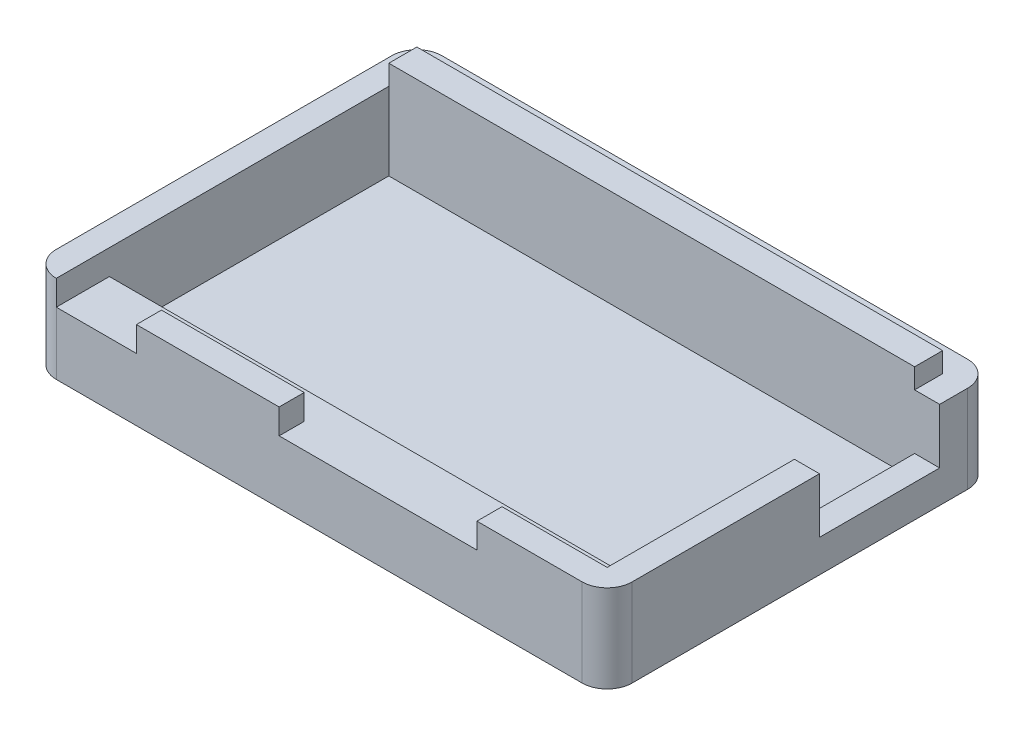
ISO-10303-21;
HEADER;
FILE_DESCRIPTION(('STEP AP214'),'2;1');
FILE_NAME('part.step','',(''),(''),'','','');
FILE_SCHEMA(('AUTOMOTIVE_DESIGN { 1 0 10303 214 1 1 1 1 }'));
ENDSEC;
DATA;
#1=APPLICATION_CONTEXT('core data for automotive mechanical design processes');
#2=APPLICATION_PROTOCOL_DEFINITION('international standard','automotive_design',2000,#1);
#3=PRODUCT_CONTEXT('',#1,'mechanical');
#4=PRODUCT('Part','Part','',(#3));
#5=PRODUCT_RELATED_PRODUCT_CATEGORY('part','',(#4));
#6=PRODUCT_DEFINITION_FORMATION('','',#4);
#7=PRODUCT_DEFINITION_CONTEXT('part definition',#1,'design');
#8=PRODUCT_DEFINITION('design','',#6,#7);
#9=PRODUCT_DEFINITION_SHAPE('','',#8);
#10=(LENGTH_UNIT() NAMED_UNIT(*) SI_UNIT(.MILLI.,.METRE.));
#11=(NAMED_UNIT(*) PLANE_ANGLE_UNIT() SI_UNIT($,.RADIAN.));
#12=(NAMED_UNIT(*) SI_UNIT($,.STERADIAN.) SOLID_ANGLE_UNIT());
#13=UNCERTAINTY_MEASURE_WITH_UNIT(LENGTH_MEASURE(1.E-05),#10,'distance_accuracy_value','');
#14=(GEOMETRIC_REPRESENTATION_CONTEXT(3) GLOBAL_UNCERTAINTY_ASSIGNED_CONTEXT((#13)) GLOBAL_UNIT_ASSIGNED_CONTEXT((#10,
#11,#12)) REPRESENTATION_CONTEXT('',''));
#15=CARTESIAN_POINT('',(0.,0.,0.));
#16=DIRECTION('',(0.,0.,1.));
#17=DIRECTION('',(1.,0.,0.));
#18=AXIS2_PLACEMENT_3D('',#15,#16,#17);
#19=CARTESIAN_POINT('',(2.5,10.25,-2.49999999999999));
#20=DIRECTION('',(0.,0.,-1.));
#21=DIRECTION('',(-1.,0.,0.));
#22=AXIS2_PLACEMENT_3D('',#19,#20,#21);
#23=PLANE('',#22);
#24=DIRECTION('',(0.,-1.,0.));
#25=VECTOR('',#24,1.);
#26=CARTESIAN_POINT('',(44.5,10.25,-2.49999999999999));
#27=LINE('',#26,#25);
#28=CARTESIAN_POINT('',(44.5,10.25,-2.49999999999999));
#29=VERTEX_POINT('',#28);
#30=CARTESIAN_POINT('',(44.5,7.75,-2.49999999999999));
#31=VERTEX_POINT('',#30);
#32=EDGE_CURVE('E314',#29,#31,#27,.T.);
#33=ORIENTED_EDGE('',*,*,#32,.F.);
#34=DIRECTION('',(1.,0.,0.));
#35=VECTOR('',#34,1.);
#36=CARTESIAN_POINT('',(2.5,10.25,-2.49999999999999));
#37=LINE('',#36,#35);
#38=CARTESIAN_POINT('',(55.,10.25,-2.49999999999999));
#39=VERTEX_POINT('',#38);
#40=EDGE_CURVE('E236',#29,#39,#37,.T.);
#41=ORIENTED_EDGE('',*,*,#40,.T.);
#42=DIRECTION('',(0.,-1.,0.));
#43=VECTOR('',#42,1.);
#44=CARTESIAN_POINT('',(55.,10.25,-2.49999999999999));
#45=LINE('',#44,#43);
#46=CARTESIAN_POINT('',(55.,7.75,-2.49999999999999));
#47=VERTEX_POINT('',#46);
#48=EDGE_CURVE('E239',#39,#47,#45,.T.);
#49=ORIENTED_EDGE('',*,*,#48,.T.);
#50=DIRECTION('',(1.,0.,0.));
#51=VECTOR('',#50,1.);
#52=CARTESIAN_POINT('',(2.5,7.75,-2.49999999999999));
#53=LINE('',#52,#51);
#54=EDGE_CURVE('E369',#31,#47,#53,.T.);
#55=ORIENTED_EDGE('',*,*,#54,.F.);
#56=EDGE_LOOP('',(#33,#41,#49,#55));
#57=FACE_BOUND('',#56,.T.);
#58=ADVANCED_FACE('F35',(#57),#23,.T.);
#59=CARTESIAN_POINT('',(0.,10.25,0.));
#60=DIRECTION('',(0.,-1.,0.));
#61=DIRECTION('',(0.,0.,-1.));
#62=AXIS2_PLACEMENT_3D('',#59,#60,#61);
#63=PLANE('',#62);
#64=DIRECTION('',(0.,0.,1.));
#65=VECTOR('',#64,1.);
#66=CARTESIAN_POINT('',(0.,10.25,0.));
#67=LINE('',#66,#65);
#68=CARTESIAN_POINT('',(0.,10.25,-36.));
#69=VERTEX_POINT('',#68);
#70=CARTESIAN_POINT('',(0.,10.25,-2.5));
#71=VERTEX_POINT('',#70);
#72=EDGE_CURVE('E255',#69,#71,#67,.T.);
#73=ORIENTED_EDGE('',*,*,#72,.T.);
#74=CARTESIAN_POINT('',(2.5,10.25,-2.5));
#75=DIRECTION('',(0.,-1.,0.));
#76=DIRECTION('',(0.,0.,-1.));
#77=AXIS2_PLACEMENT_3D('',#74,#75,#76);
#78=CIRCLE('',#77,2.5);
#79=CARTESIAN_POINT('',(2.5,10.25,0.));
#80=VERTEX_POINT('',#79);
#81=EDGE_CURVE('E279',#71,#80,#78,.F.);
#82=ORIENTED_EDGE('',*,*,#81,.T.);
#83=DIRECTION('',(0.,0.,1.));
#84=VECTOR('',#83,1.);
#85=CARTESIAN_POINT('',(2.5,10.25,-36.));
#86=LINE('',#85,#84);
#87=CARTESIAN_POINT('',(2.5,10.25,-33.2));
#88=VERTEX_POINT('',#87);
#89=EDGE_CURVE('E415',#88,#80,#86,.T.);
#90=ORIENTED_EDGE('',*,*,#89,.F.);
#91=CARTESIAN_POINT('',(2.5,10.25,-36.));
#92=VERTEX_POINT('',#91);
#93=EDGE_CURVE('E241',#92,#88,#86,.T.);
#94=ORIENTED_EDGE('',*,*,#93,.F.);
#95=DIRECTION('',(-1.,0.,0.));
#96=VECTOR('',#95,1.);
#97=CARTESIAN_POINT('',(55.,10.25,-36.));
#98=LINE('',#97,#96);
#99=CARTESIAN_POINT('',(55.,10.25,-36.));
#100=VERTEX_POINT('',#99);
#101=EDGE_CURVE('E414',#100,#92,#98,.T.);
#102=ORIENTED_EDGE('',*,*,#101,.F.);
#103=DIRECTION('',(0.,0.,-1.));
#104=VECTOR('',#103,1.);
#105=CARTESIAN_POINT('',(55.,10.25,0.));
#106=LINE('',#105,#104);
#107=CARTESIAN_POINT('',(55.,10.25,-33.2));
#108=VERTEX_POINT('',#107);
#109=EDGE_CURVE('E407',#108,#100,#106,.T.);
#110=ORIENTED_EDGE('',*,*,#109,.F.);
#111=DIRECTION('',(1.,0.,0.));
#112=VECTOR('',#111,1.);
#113=CARTESIAN_POINT('',(41.7996212175559,10.25,-33.2));
#114=LINE('',#113,#112);
#115=CARTESIAN_POINT('',(57.5,10.25,-33.2));
#116=VERTEX_POINT('',#115);
#117=EDGE_CURVE('E302',#108,#116,#114,.T.);
#118=ORIENTED_EDGE('',*,*,#117,.T.);
#119=DIRECTION('',(0.,0.,-1.));
#120=VECTOR('',#119,1.);
#121=CARTESIAN_POINT('',(57.5,10.25,-38.5));
#122=LINE('',#121,#120);
#123=CARTESIAN_POINT('',(57.5,10.25,-36.));
#124=VERTEX_POINT('',#123);
#125=EDGE_CURVE('E253',#116,#124,#122,.T.);
#126=ORIENTED_EDGE('',*,*,#125,.T.);
#127=CARTESIAN_POINT('',(55.,10.25,-36.));
#128=DIRECTION('',(0.,-1.,0.));
#129=DIRECTION('',(0.,0.,-1.));
#130=AXIS2_PLACEMENT_3D('',#127,#128,#129);
#131=CIRCLE('',#130,2.5);
#132=CARTESIAN_POINT('',(55.,10.25,-38.5));
#133=VERTEX_POINT('',#132);
#134=EDGE_CURVE('E275',#124,#133,#131,.F.);
#135=ORIENTED_EDGE('',*,*,#134,.T.);
#136=DIRECTION('',(-1.,0.,0.));
#137=VECTOR('',#136,1.);
#138=CARTESIAN_POINT('',(0.,10.25,-38.5));
#139=LINE('',#138,#137);
#140=CARTESIAN_POINT('',(2.5,10.25,-38.5));
#141=VERTEX_POINT('',#140);
#142=EDGE_CURVE('E252',#133,#141,#139,.T.);
#143=ORIENTED_EDGE('',*,*,#142,.T.);
#144=CARTESIAN_POINT('',(2.5,10.25,-36.));
#145=DIRECTION('',(0.,-1.,0.));
#146=DIRECTION('',(0.,0.,-1.));
#147=AXIS2_PLACEMENT_3D('',#144,#145,#146);
#148=CIRCLE('',#147,2.5);
#149=EDGE_CURVE('E277',#141,#69,#148,.F.);
#150=ORIENTED_EDGE('',*,*,#149,.T.);
#151=EDGE_LOOP('',(#73,#82,#90,#94,#102,#110,#118,#126,#135,#143,#150));
#152=FACE_BOUND('',#151,.T.);
#153=ADVANCED_FACE('F300',(#152),#63,.F.);
#154=DIRECTION('',(1.,0.,0.));
#155=VECTOR('',#154,1.);
#156=CARTESIAN_POINT('',(57.5,10.25,0.));
#157=LINE('',#156,#155);
#158=CARTESIAN_POINT('',(44.5,10.25,0.));
#159=VERTEX_POINT('',#158);
#160=CARTESIAN_POINT('',(55.,10.25,0.));
#161=VERTEX_POINT('',#160);
#162=EDGE_CURVE('E247',#159,#161,#157,.T.);
#163=ORIENTED_EDGE('',*,*,#162,.T.);
#164=CARTESIAN_POINT('',(55.,10.25,-2.5));
#165=DIRECTION('',(0.,-1.,0.));
#166=DIRECTION('',(0.,0.,-1.));
#167=AXIS2_PLACEMENT_3D('',#164,#165,#166);
#168=CIRCLE('',#167,2.5);
#169=CARTESIAN_POINT('',(57.5,10.25,-2.50000000000002));
#170=VERTEX_POINT('',#169);
#171=EDGE_CURVE('E11',#161,#170,#168,.F.);
#172=ORIENTED_EDGE('',*,*,#171,.T.);
#173=CARTESIAN_POINT('',(57.5,10.25,-21.2));
#174=VERTEX_POINT('',#173);
#175=EDGE_CURVE('E250',#170,#174,#122,.T.);
#176=ORIENTED_EDGE('',*,*,#175,.T.);
#177=DIRECTION('',(1.,0.,0.));
#178=VECTOR('',#177,1.);
#179=CARTESIAN_POINT('',(41.7996212175559,10.25,-21.2));
#180=LINE('',#179,#178);
#181=CARTESIAN_POINT('',(55.,10.25,-21.2));
#182=VERTEX_POINT('',#181);
#183=EDGE_CURVE('E347',#182,#174,#180,.T.);
#184=ORIENTED_EDGE('',*,*,#183,.F.);
#185=DIRECTION('',(0.,0.,-1.));
#186=VECTOR('',#185,1.);
#187=CARTESIAN_POINT('',(55.,10.25,-2.49999999999999));
#188=LINE('',#187,#186);
#189=EDGE_CURVE('E235',#39,#182,#188,.T.);
#190=ORIENTED_EDGE('',*,*,#189,.F.);
#191=ORIENTED_EDGE('',*,*,#40,.F.);
#192=DIRECTION('',(0.,0.,-1.));
#193=VECTOR('',#192,1.);
#194=CARTESIAN_POINT('',(44.5,10.25,19.9075990516185));
#195=LINE('',#194,#193);
#196=EDGE_CURVE('E331',#159,#29,#195,.T.);
#197=ORIENTED_EDGE('',*,*,#196,.F.);
#198=EDGE_LOOP('',(#163,#172,#176,#184,#190,#191,#197));
#199=FACE_BOUND('',#198,.T.);
#200=ADVANCED_FACE('F492',(#199),#63,.F.);
#201=CARTESIAN_POINT('',(2.5,10.25,-36.));
#202=DIRECTION('',(1.,0.,0.));
#203=DIRECTION('',(0.,0.,-1.));
#204=AXIS2_PLACEMENT_3D('',#201,#202,#203);
#205=PLANE('',#204);
#206=DIRECTION('',(0.,0.,1.));
#207=VECTOR('',#206,1.);
#208=CARTESIAN_POINT('',(2.5,7.75,-2.49999999999999));
#209=LINE('',#208,#207);
#210=CARTESIAN_POINT('',(2.5,7.75,-5.29999999999999));
#211=VERTEX_POINT('',#210);
#212=CARTESIAN_POINT('',(2.5,7.75000000000001,0.));
#213=VERTEX_POINT('',#212);
#214=EDGE_CURVE('E366',#211,#213,#209,.T.);
#215=ORIENTED_EDGE('',*,*,#214,.F.);
#216=DIRECTION('',(0.,-1.,0.));
#217=VECTOR('',#216,1.);
#218=CARTESIAN_POINT('',(2.5,7.75,-5.29999999999999));
#219=LINE('',#218,#217);
#220=CARTESIAN_POINT('',(2.5,2.5,-5.29999999999999));
#221=VERTEX_POINT('',#220);
#222=EDGE_CURVE('E375',#211,#221,#219,.T.);
#223=ORIENTED_EDGE('',*,*,#222,.T.);
#224=DIRECTION('',(0.,0.,1.));
#225=VECTOR('',#224,1.);
#226=CARTESIAN_POINT('',(2.5,2.5,-36.));
#227=LINE('',#226,#225);
#228=CARTESIAN_POINT('',(2.5,2.5,-33.2));
#229=VERTEX_POINT('',#228);
#230=EDGE_CURVE('E409',#229,#221,#227,.T.);
#231=ORIENTED_EDGE('',*,*,#230,.F.);
#232=DIRECTION('',(0.,-1.,0.));
#233=VECTOR('',#232,1.);
#234=CARTESIAN_POINT('',(2.5,12.25,-33.2));
#235=LINE('',#234,#233);
#236=EDGE_CURVE('E403',#88,#229,#235,.T.);
#237=ORIENTED_EDGE('',*,*,#236,.F.);
#238=ORIENTED_EDGE('',*,*,#89,.T.);
#239=DIRECTION('',(0.,-1.,0.));
#240=VECTOR('',#239,1.);
#241=CARTESIAN_POINT('',(2.5,10.25,0.));
#242=LINE('',#241,#240);
#243=EDGE_CURVE('E323',#80,#213,#242,.T.);
#244=ORIENTED_EDGE('',*,*,#243,.T.);
#245=EDGE_LOOP('',(#215,#223,#231,#237,#238,#244));
#246=FACE_BOUND('',#245,.T.);
#247=ADVANCED_FACE('F435',(#246),#205,.T.);
#248=CARTESIAN_POINT('',(55.,10.25,-2.49999999999999));
#249=DIRECTION('',(-1.,0.,0.));
#250=DIRECTION('',(0.,0.,1.));
#251=AXIS2_PLACEMENT_3D('',#248,#249,#250);
#252=PLANE('',#251);
#253=DIRECTION('',(0.,-1.,0.));
#254=VECTOR('',#253,1.);
#255=CARTESIAN_POINT('',(55.,4.75,-21.2));
#256=LINE('',#255,#254);
#257=CARTESIAN_POINT('',(55.,4.75,-21.2));
#258=VERTEX_POINT('',#257);
#259=EDGE_CURVE('E357',#182,#258,#256,.T.);
#260=ORIENTED_EDGE('',*,*,#259,.T.);
#261=DIRECTION('',(0.,0.,-1.));
#262=VECTOR('',#261,1.);
#263=CARTESIAN_POINT('',(55.,4.75,-33.2));
#264=LINE('',#263,#262);
#265=CARTESIAN_POINT('',(55.,4.75,-33.2));
#266=VERTEX_POINT('',#265);
#267=EDGE_CURVE('E352',#258,#266,#264,.T.);
#268=ORIENTED_EDGE('',*,*,#267,.T.);
#269=DIRECTION('',(0.,-1.,0.));
#270=VECTOR('',#269,1.);
#271=CARTESIAN_POINT('',(55.,12.25,-33.2));
#272=LINE('',#271,#270);
#273=CARTESIAN_POINT('',(55.,2.5,-33.2));
#274=VERTEX_POINT('',#273);
#275=EDGE_CURVE('E399',#266,#274,#272,.T.);
#276=ORIENTED_EDGE('',*,*,#275,.T.);
#277=DIRECTION('',(0.,0.,-1.));
#278=VECTOR('',#277,1.);
#279=CARTESIAN_POINT('',(55.,2.5,-36.));
#280=LINE('',#279,#278);
#281=CARTESIAN_POINT('',(55.,2.5,-5.29999999999999));
#282=VERTEX_POINT('',#281);
#283=EDGE_CURVE('E412',#282,#274,#280,.T.);
#284=ORIENTED_EDGE('',*,*,#283,.F.);
#285=DIRECTION('',(0.,-1.,0.));
#286=VECTOR('',#285,1.);
#287=CARTESIAN_POINT('',(55.,7.75,-5.29999999999999));
#288=LINE('',#287,#286);
#289=CARTESIAN_POINT('',(55.,7.75,-5.29999999999999));
#290=VERTEX_POINT('',#289);
#291=EDGE_CURVE('E379',#290,#282,#288,.T.);
#292=ORIENTED_EDGE('',*,*,#291,.F.);
#293=DIRECTION('',(0.,0.,-1.));
#294=VECTOR('',#293,1.);
#295=CARTESIAN_POINT('',(55.,7.75,-2.49999999999999));
#296=LINE('',#295,#294);
#297=EDGE_CURVE('E371',#47,#290,#296,.T.);
#298=ORIENTED_EDGE('',*,*,#297,.F.);
#299=ORIENTED_EDGE('',*,*,#48,.F.);
#300=ORIENTED_EDGE('',*,*,#189,.T.);
#301=EDGE_LOOP('',(#260,#268,#276,#284,#292,#298,#299,#300));
#302=FACE_BOUND('',#301,.T.);
#303=ADVANCED_FACE('F460',(#302),#252,.T.);
#304=CARTESIAN_POINT('',(0.,2.5,0.));
#305=DIRECTION('',(0.,1.,0.));
#306=DIRECTION('',(0.,0.,1.));
#307=AXIS2_PLACEMENT_3D('',#304,#305,#306);
#308=PLANE('',#307);
#309=ORIENTED_EDGE('',*,*,#230,.T.);
#310=DIRECTION('',(-1.,0.,0.));
#311=VECTOR('',#310,1.);
#312=CARTESIAN_POINT('',(2.5,2.5,-5.29999999999999));
#313=LINE('',#312,#311);
#314=EDGE_CURVE('E365',#282,#221,#313,.T.);
#315=ORIENTED_EDGE('',*,*,#314,.F.);
#316=ORIENTED_EDGE('',*,*,#283,.T.);
#317=DIRECTION('',(1.,0.,0.));
#318=VECTOR('',#317,1.);
#319=CARTESIAN_POINT('',(2.5,2.5,-33.2));
#320=LINE('',#319,#318);
#321=EDGE_CURVE('E381',#229,#274,#320,.T.);
#322=ORIENTED_EDGE('',*,*,#321,.F.);
#323=EDGE_LOOP('',(#309,#315,#316,#322));
#324=FACE_BOUND('',#323,.T.);
#325=ADVANCED_FACE('F456',(#324),#308,.T.);
#326=DIRECTION('',(0.,-1.,0.));
#327=VECTOR('',#326,1.);
#328=CARTESIAN_POINT('',(10.5,10.25,-2.49999999999999));
#329=LINE('',#328,#327);
#330=CARTESIAN_POINT('',(10.5,10.25,-2.49999999999999));
#331=VERTEX_POINT('',#330);
#332=CARTESIAN_POINT('',(10.5,7.75,-2.49999999999999));
#333=VERTEX_POINT('',#332);
#334=EDGE_CURVE('E212',#331,#333,#329,.T.);
#335=ORIENTED_EDGE('',*,*,#334,.F.);
#336=CARTESIAN_POINT('',(24.75,10.25,-2.49999999999999));
#337=VERTEX_POINT('',#336);
#338=EDGE_CURVE('E227',#331,#337,#37,.T.);
#339=ORIENTED_EDGE('',*,*,#338,.T.);
#340=DIRECTION('',(0.,1.,0.));
#341=VECTOR('',#340,1.);
#342=CARTESIAN_POINT('',(24.75,10.25,-2.49999999999999));
#343=LINE('',#342,#341);
#344=CARTESIAN_POINT('',(24.75,7.75,-2.49999999999999));
#345=VERTEX_POINT('',#344);
#346=EDGE_CURVE('E334',#345,#337,#343,.T.);
#347=ORIENTED_EDGE('',*,*,#346,.F.);
#348=EDGE_CURVE('E229',#333,#345,#53,.T.);
#349=ORIENTED_EDGE('',*,*,#348,.F.);
#350=EDGE_LOOP('',(#335,#339,#347,#349));
#351=FACE_BOUND('',#350,.T.);
#352=ADVANCED_FACE('F225',(#351),#23,.T.);
#353=ORIENTED_EDGE('',*,*,#338,.F.);
#354=DIRECTION('',(0.,0.,-1.));
#355=VECTOR('',#354,1.);
#356=CARTESIAN_POINT('',(10.5,10.25,19.9075990516185));
#357=LINE('',#356,#355);
#358=CARTESIAN_POINT('',(10.5,10.25,0.));
#359=VERTEX_POINT('',#358);
#360=EDGE_CURVE('E208',#359,#331,#357,.T.);
#361=ORIENTED_EDGE('',*,*,#360,.F.);
#362=CARTESIAN_POINT('',(24.75,10.25,0.));
#363=VERTEX_POINT('',#362);
#364=EDGE_CURVE('E249',#359,#363,#157,.T.);
#365=ORIENTED_EDGE('',*,*,#364,.T.);
#366=DIRECTION('',(0.,0.,-1.));
#367=VECTOR('',#366,1.);
#368=CARTESIAN_POINT('',(24.75,10.25,19.9075990516185));
#369=LINE('',#368,#367);
#370=EDGE_CURVE('E234',#363,#337,#369,.T.);
#371=ORIENTED_EDGE('',*,*,#370,.T.);
#372=EDGE_LOOP('',(#353,#361,#365,#371));
#373=FACE_BOUND('',#372,.T.);
#374=ADVANCED_FACE('F233',(#373),#63,.F.);
#375=CARTESIAN_POINT('',(57.5,10.25,0.));
#376=DIRECTION('',(0.,0.,-1.));
#377=DIRECTION('',(-1.,0.,0.));
#378=AXIS2_PLACEMENT_3D('',#375,#376,#377);
#379=PLANE('',#378);
#380=DIRECTION('',(1.,0.,0.));
#381=VECTOR('',#380,1.);
#382=CARTESIAN_POINT('',(2.5,7.75000000000001,0.));
#383=LINE('',#382,#381);
#384=CARTESIAN_POINT('',(10.5,7.75000000000001,0.));
#385=VERTEX_POINT('',#384);
#386=EDGE_CURVE('E321',#213,#385,#383,.T.);
#387=ORIENTED_EDGE('',*,*,#386,.F.);
#388=DIRECTION('',(0.,-1.,0.));
#389=VECTOR('',#388,1.);
#390=CARTESIAN_POINT('',(2.5,10.25,0.));
#391=LINE('',#390,#389);
#392=CARTESIAN_POINT('',(2.50000000000003,1.5,0.));
#393=VERTEX_POINT('',#392);
#394=EDGE_CURVE('E260',#213,#393,#391,.T.);
#395=ORIENTED_EDGE('',*,*,#394,.T.);
#396=DIRECTION('',(-1.,0.,0.));
#397=VECTOR('',#396,1.);
#398=CARTESIAN_POINT('',(96.029209698617,1.5,0.));
#399=LINE('',#398,#397);
#400=CARTESIAN_POINT('',(55.,1.5,0.));
#401=VERTEX_POINT('',#400);
#402=EDGE_CURVE('E312',#401,#393,#399,.T.);
#403=ORIENTED_EDGE('',*,*,#402,.F.);
#404=DIRECTION('',(0.,-1.,0.));
#405=VECTOR('',#404,1.);
#406=CARTESIAN_POINT('',(55.,10.25,0.));
#407=LINE('',#406,#405);
#408=EDGE_CURVE('E258',#401,#161,#407,.F.);
#409=ORIENTED_EDGE('',*,*,#408,.T.);
#410=ORIENTED_EDGE('',*,*,#162,.F.);
#411=DIRECTION('',(0.,1.,0.));
#412=VECTOR('',#411,1.);
#413=CARTESIAN_POINT('',(44.5,10.25,0.));
#414=LINE('',#413,#412);
#415=CARTESIAN_POINT('',(44.5,7.75,0.));
#416=VERTEX_POINT('',#415);
#417=EDGE_CURVE('E330',#416,#159,#414,.T.);
#418=ORIENTED_EDGE('',*,*,#417,.F.);
#419=DIRECTION('',(1.,0.,0.));
#420=VECTOR('',#419,1.);
#421=CARTESIAN_POINT('',(44.5,7.75,0.));
#422=LINE('',#421,#420);
#423=CARTESIAN_POINT('',(24.75,7.75,0.));
#424=VERTEX_POINT('',#423);
#425=EDGE_CURVE('E230',#424,#416,#422,.T.);
#426=ORIENTED_EDGE('',*,*,#425,.F.);
#427=DIRECTION('',(0.,-1.,0.));
#428=VECTOR('',#427,1.);
#429=CARTESIAN_POINT('',(24.75,10.25,0.));
#430=LINE('',#429,#428);
#431=EDGE_CURVE('E328',#363,#424,#430,.T.);
#432=ORIENTED_EDGE('',*,*,#431,.F.);
#433=ORIENTED_EDGE('',*,*,#364,.F.);
#434=DIRECTION('',(0.,1.,0.));
#435=VECTOR('',#434,1.);
#436=CARTESIAN_POINT('',(10.5,10.25,0.));
#437=LINE('',#436,#435);
#438=EDGE_CURVE('E215',#385,#359,#437,.T.);
#439=ORIENTED_EDGE('',*,*,#438,.F.);
#440=EDGE_LOOP('',(#387,#395,#403,#409,#410,#418,#426,#432,#433,#439));
#441=FACE_BOUND('',#440,.T.);
#442=ADVANCED_FACE('F444',(#441),#379,.F.);
#443=CARTESIAN_POINT('',(57.5,10.25,-38.5));
#444=DIRECTION('',(-1.,0.,0.));
#445=DIRECTION('',(0.,0.,1.));
#446=AXIS2_PLACEMENT_3D('',#443,#444,#445);
#447=PLANE('',#446);
#448=DIRECTION('',(0.,0.,1.));
#449=VECTOR('',#448,1.);
#450=CARTESIAN_POINT('',(57.5,1.5,-38.5));
#451=LINE('',#450,#449);
#452=CARTESIAN_POINT('',(57.5,1.5,-36.));
#453=VERTEX_POINT('',#452);
#454=CARTESIAN_POINT('',(57.5,1.5,-2.5));
#455=VERTEX_POINT('',#454);
#456=EDGE_CURVE('E295',#453,#455,#451,.T.);
#457=ORIENTED_EDGE('',*,*,#456,.F.);
#458=DIRECTION('',(0.,-1.,0.));
#459=VECTOR('',#458,1.);
#460=CARTESIAN_POINT('',(57.5,10.25,-36.));
#461=LINE('',#460,#459);
#462=EDGE_CURVE('E43',#453,#124,#461,.F.);
#463=ORIENTED_EDGE('',*,*,#462,.T.);
#464=ORIENTED_EDGE('',*,*,#125,.F.);
#465=DIRECTION('',(0.,1.,0.));
#466=VECTOR('',#465,1.);
#467=CARTESIAN_POINT('',(57.5,4.75,-33.2));
#468=LINE('',#467,#466);
#469=CARTESIAN_POINT('',(57.5,4.75,-33.2));
#470=VERTEX_POINT('',#469);
#471=EDGE_CURVE('E325',#470,#116,#468,.T.);
#472=ORIENTED_EDGE('',*,*,#471,.F.);
#473=DIRECTION('',(0.,0.,-1.));
#474=VECTOR('',#473,1.);
#475=CARTESIAN_POINT('',(57.5,4.75,-33.2));
#476=LINE('',#475,#474);
#477=CARTESIAN_POINT('',(57.5,4.75,-21.2));
#478=VERTEX_POINT('',#477);
#479=EDGE_CURVE('E344',#478,#470,#476,.T.);
#480=ORIENTED_EDGE('',*,*,#479,.F.);
#481=DIRECTION('',(0.,-1.,0.));
#482=VECTOR('',#481,1.);
#483=CARTESIAN_POINT('',(57.5,4.75,-21.2));
#484=LINE('',#483,#482);
#485=EDGE_CURVE('E348',#174,#478,#484,.T.);
#486=ORIENTED_EDGE('',*,*,#485,.F.);
#487=ORIENTED_EDGE('',*,*,#175,.F.);
#488=DIRECTION('',(0.,-1.,0.));
#489=VECTOR('',#488,1.);
#490=CARTESIAN_POINT('',(57.5,10.25,-2.5));
#491=LINE('',#490,#489);
#492=EDGE_CURVE('E285',#170,#455,#491,.T.);
#493=ORIENTED_EDGE('',*,*,#492,.T.);
#494=EDGE_LOOP('',(#457,#463,#464,#472,#480,#486,#487,#493));
#495=FACE_BOUND('',#494,.T.);
#496=ADVANCED_FACE('F292',(#495),#447,.F.);
#497=CARTESIAN_POINT('',(0.,10.25,-38.5));
#498=DIRECTION('',(0.,0.,1.));
#499=DIRECTION('',(1.,0.,0.));
#500=AXIS2_PLACEMENT_3D('',#497,#498,#499);
#501=PLANE('',#500);
#502=DIRECTION('',(-1.,0.,0.));
#503=VECTOR('',#502,1.);
#504=CARTESIAN_POINT('',(96.029209698617,1.5,-38.5));
#505=LINE('',#504,#503);
#506=CARTESIAN_POINT('',(55.,1.5,-38.5));
#507=VERTEX_POINT('',#506);
#508=CARTESIAN_POINT('',(2.50000000000003,1.5,-38.5));
#509=VERTEX_POINT('',#508);
#510=EDGE_CURVE('E307',#507,#509,#505,.T.);
#511=ORIENTED_EDGE('',*,*,#510,.T.);
#512=DIRECTION('',(0.,-1.,0.));
#513=VECTOR('',#512,1.);
#514=CARTESIAN_POINT('',(2.5,10.25,-38.5));
#515=LINE('',#514,#513);
#516=EDGE_CURVE('E56',#509,#141,#515,.F.);
#517=ORIENTED_EDGE('',*,*,#516,.T.);
#518=ORIENTED_EDGE('',*,*,#142,.F.);
#519=DIRECTION('',(0.,-1.,0.));
#520=VECTOR('',#519,1.);
#521=CARTESIAN_POINT('',(55.,10.25,-38.5));
#522=LINE('',#521,#520);
#523=EDGE_CURVE('E281',#133,#507,#522,.T.);
#524=ORIENTED_EDGE('',*,*,#523,.T.);
#525=EDGE_LOOP('',(#511,#517,#518,#524));
#526=FACE_BOUND('',#525,.T.);
#527=ADVANCED_FACE('F306',(#526),#501,.F.);
#528=CARTESIAN_POINT('',(0.,10.25,0.));
#529=DIRECTION('',(1.,0.,0.));
#530=DIRECTION('',(0.,0.,-1.));
#531=AXIS2_PLACEMENT_3D('',#528,#529,#530);
#532=PLANE('',#531);
#533=DIRECTION('',(0.,0.,-1.));
#534=VECTOR('',#533,1.);
#535=CARTESIAN_POINT('',(0.,1.5,-38.5));
#536=LINE('',#535,#534);
#537=CARTESIAN_POINT('',(0.,1.5,-2.50000000000002));
#538=VERTEX_POINT('',#537);
#539=CARTESIAN_POINT('',(0.,1.5,-36.));
#540=VERTEX_POINT('',#539);
#541=EDGE_CURVE('E316',#538,#540,#536,.T.);
#542=ORIENTED_EDGE('',*,*,#541,.F.);
#543=DIRECTION('',(0.,-1.,0.));
#544=VECTOR('',#543,1.);
#545=CARTESIAN_POINT('',(0.,10.25,-2.5));
#546=LINE('',#545,#544);
#547=EDGE_CURVE('E273',#538,#71,#546,.F.);
#548=ORIENTED_EDGE('',*,*,#547,.T.);
#549=ORIENTED_EDGE('',*,*,#72,.F.);
#550=DIRECTION('',(0.,-1.,0.));
#551=VECTOR('',#550,1.);
#552=CARTESIAN_POINT('',(0.,10.25,-36.));
#553=LINE('',#552,#551);
#554=EDGE_CURVE('E270',#69,#540,#553,.T.);
#555=ORIENTED_EDGE('',*,*,#554,.T.);
#556=EDGE_LOOP('',(#542,#548,#549,#555));
#557=FACE_BOUND('',#556,.T.);
#558=ADVANCED_FACE('F508',(#557),#532,.F.);
#559=CARTESIAN_POINT('',(2.5,12.25,-36.));
#560=DIRECTION('',(1.,0.,0.));
#561=DIRECTION('',(0.,0.,-1.));
#562=AXIS2_PLACEMENT_3D('',#559,#560,#561);
#563=PLANE('',#562);
#564=DIRECTION('',(0.,-1.,0.));
#565=VECTOR('',#564,1.);
#566=CARTESIAN_POINT('',(2.5,12.25,-36.));
#567=LINE('',#566,#565);
#568=CARTESIAN_POINT('',(2.5,12.25,-36.));
#569=VERTEX_POINT('',#568);
#570=EDGE_CURVE('E391',#569,#92,#567,.T.);
#571=ORIENTED_EDGE('',*,*,#570,.T.);
#572=ORIENTED_EDGE('',*,*,#93,.T.);
#573=CARTESIAN_POINT('',(2.5,12.25,-33.2));
#574=VERTEX_POINT('',#573);
#575=EDGE_CURVE('E404',#574,#88,#235,.T.);
#576=ORIENTED_EDGE('',*,*,#575,.F.);
#577=DIRECTION('',(0.,0.,1.));
#578=VECTOR('',#577,1.);
#579=CARTESIAN_POINT('',(2.5,12.25,-36.));
#580=LINE('',#579,#578);
#581=EDGE_CURVE('E382',#569,#574,#580,.T.);
#582=ORIENTED_EDGE('',*,*,#581,.F.);
#583=EDGE_LOOP('',(#571,#572,#576,#582));
#584=FACE_BOUND('',#583,.T.);
#585=ADVANCED_FACE('F427',(#584),#563,.F.);
#586=CARTESIAN_POINT('',(55.,12.25,-36.));
#587=DIRECTION('',(-1.,0.,0.));
#588=DIRECTION('',(0.,0.,1.));
#589=AXIS2_PLACEMENT_3D('',#586,#587,#588);
#590=PLANE('',#589);
#591=CARTESIAN_POINT('',(55.,12.25,-33.2));
#592=VERTEX_POINT('',#591);
#593=EDGE_CURVE('E400',#592,#108,#272,.T.);
#594=ORIENTED_EDGE('',*,*,#593,.T.);
#595=ORIENTED_EDGE('',*,*,#109,.T.);
#596=DIRECTION('',(0.,-1.,0.));
#597=VECTOR('',#596,1.);
#598=CARTESIAN_POINT('',(55.,12.25,-36.));
#599=LINE('',#598,#597);
#600=CARTESIAN_POINT('',(55.,12.25,-36.));
#601=VERTEX_POINT('',#600);
#602=EDGE_CURVE('E396',#601,#100,#599,.T.);
#603=ORIENTED_EDGE('',*,*,#602,.F.);
#604=DIRECTION('',(0.,0.,-1.));
#605=VECTOR('',#604,1.);
#606=CARTESIAN_POINT('',(55.,12.25,-36.));
#607=LINE('',#606,#605);
#608=EDGE_CURVE('E387',#592,#601,#607,.T.);
#609=ORIENTED_EDGE('',*,*,#608,.F.);
#610=EDGE_LOOP('',(#594,#595,#603,#609));
#611=FACE_BOUND('',#610,.T.);
#612=ADVANCED_FACE('F471',(#611),#590,.F.);
#613=CARTESIAN_POINT('',(2.5,12.25,-36.));
#614=DIRECTION('',(0.,0.,1.));
#615=DIRECTION('',(1.,0.,0.));
#616=AXIS2_PLACEMENT_3D('',#613,#614,#615);
#617=PLANE('',#616);
#618=ORIENTED_EDGE('',*,*,#602,.T.);
#619=ORIENTED_EDGE('',*,*,#101,.T.);
#620=ORIENTED_EDGE('',*,*,#570,.F.);
#621=DIRECTION('',(-1.,0.,0.));
#622=VECTOR('',#621,1.);
#623=CARTESIAN_POINT('',(2.5,12.25,-36.));
#624=LINE('',#623,#622);
#625=EDGE_CURVE('E389',#601,#569,#624,.T.);
#626=ORIENTED_EDGE('',*,*,#625,.F.);
#627=EDGE_LOOP('',(#618,#619,#620,#626));
#628=FACE_BOUND('',#627,.T.);
#629=ADVANCED_FACE('F476',(#628),#617,.F.);
#630=CARTESIAN_POINT('',(2.5,12.25,-33.2));
#631=DIRECTION('',(0.,0.,-1.));
#632=DIRECTION('',(-1.,0.,0.));
#633=AXIS2_PLACEMENT_3D('',#630,#631,#632);
#634=PLANE('',#633);
#635=ORIENTED_EDGE('',*,*,#321,.T.);
#636=ORIENTED_EDGE('',*,*,#275,.F.);
#637=DIRECTION('',(1.,0.,0.));
#638=VECTOR('',#637,1.);
#639=CARTESIAN_POINT('',(41.7996212175559,4.75,-33.2));
#640=LINE('',#639,#638);
#641=EDGE_CURVE('E355',#266,#470,#640,.T.);
#642=ORIENTED_EDGE('',*,*,#641,.T.);
#643=ORIENTED_EDGE('',*,*,#471,.T.);
#644=ORIENTED_EDGE('',*,*,#117,.F.);
#645=ORIENTED_EDGE('',*,*,#593,.F.);
#646=DIRECTION('',(1.,0.,0.));
#647=VECTOR('',#646,1.);
#648=CARTESIAN_POINT('',(2.5,12.25,-33.2));
#649=LINE('',#648,#647);
#650=EDGE_CURVE('E385',#574,#592,#649,.T.);
#651=ORIENTED_EDGE('',*,*,#650,.F.);
#652=ORIENTED_EDGE('',*,*,#575,.T.);
#653=ORIENTED_EDGE('',*,*,#236,.T.);
#654=EDGE_LOOP('',(#635,#636,#642,#643,#644,#645,#651,#652,#653));
#655=FACE_BOUND('',#654,.T.);
#656=ADVANCED_FACE('F430',(#655),#634,.F.);
#657=CARTESIAN_POINT('',(0.,12.25,0.));
#658=DIRECTION('',(0.,1.,0.));
#659=DIRECTION('',(0.,0.,1.));
#660=AXIS2_PLACEMENT_3D('',#657,#658,#659);
#661=PLANE('',#660);
#662=ORIENTED_EDGE('',*,*,#581,.T.);
#663=ORIENTED_EDGE('',*,*,#650,.T.);
#664=ORIENTED_EDGE('',*,*,#608,.T.);
#665=ORIENTED_EDGE('',*,*,#625,.T.);
#666=EDGE_LOOP('',(#662,#663,#664,#665));
#667=FACE_BOUND('',#666,.T.);
#668=ADVANCED_FACE('F475',(#667),#661,.T.);
#669=CARTESIAN_POINT('',(2.5,7.75,-5.29999999999999));
#670=DIRECTION('',(0.,0.,1.));
#671=DIRECTION('',(1.,0.,0.));
#672=AXIS2_PLACEMENT_3D('',#669,#670,#671);
#673=PLANE('',#672);
#674=ORIENTED_EDGE('',*,*,#314,.T.);
#675=ORIENTED_EDGE('',*,*,#222,.F.);
#676=DIRECTION('',(-1.,0.,0.));
#677=VECTOR('',#676,1.);
#678=CARTESIAN_POINT('',(2.5,7.75,-5.29999999999999));
#679=LINE('',#678,#677);
#680=EDGE_CURVE('E373',#290,#211,#679,.T.);
#681=ORIENTED_EDGE('',*,*,#680,.F.);
#682=ORIENTED_EDGE('',*,*,#291,.T.);
#683=EDGE_LOOP('',(#674,#675,#681,#682));
#684=FACE_BOUND('',#683,.T.);
#685=ADVANCED_FACE('F453',(#684),#673,.F.);
#686=CARTESIAN_POINT('',(0.,7.75,0.));
#687=DIRECTION('',(0.,-1.,0.));
#688=DIRECTION('',(0.,0.,-1.));
#689=AXIS2_PLACEMENT_3D('',#686,#687,#688);
#690=PLANE('',#689);
#691=ORIENTED_EDGE('',*,*,#214,.T.);
#692=ORIENTED_EDGE('',*,*,#386,.T.);
#693=DIRECTION('',(0.,0.,-1.));
#694=VECTOR('',#693,1.);
#695=CARTESIAN_POINT('',(10.5,7.75000000000001,19.9075990516185));
#696=LINE('',#695,#694);
#697=EDGE_CURVE('E220',#385,#333,#696,.T.);
#698=ORIENTED_EDGE('',*,*,#697,.T.);
#699=ORIENTED_EDGE('',*,*,#348,.T.);
#700=DIRECTION('',(0.,0.,-1.));
#701=VECTOR('',#700,1.);
#702=CARTESIAN_POINT('',(24.75,7.75,19.9075990516185));
#703=LINE('',#702,#701);
#704=EDGE_CURVE('E339',#424,#345,#703,.T.);
#705=ORIENTED_EDGE('',*,*,#704,.F.);
#706=ORIENTED_EDGE('',*,*,#425,.T.);
#707=DIRECTION('',(0.,0.,-1.));
#708=VECTOR('',#707,1.);
#709=CARTESIAN_POINT('',(44.5,7.75,19.9075990516185));
#710=LINE('',#709,#708);
#711=EDGE_CURVE('E336',#416,#31,#710,.T.);
#712=ORIENTED_EDGE('',*,*,#711,.T.);
#713=ORIENTED_EDGE('',*,*,#54,.T.);
#714=ORIENTED_EDGE('',*,*,#297,.T.);
#715=ORIENTED_EDGE('',*,*,#680,.T.);
#716=EDGE_LOOP('',(#691,#692,#698,#699,#705,#706,#712,#713,#714,#715));
#717=FACE_BOUND('',#716,.T.);
#718=ADVANCED_FACE('F447',(#717),#690,.F.);
#719=CARTESIAN_POINT('',(41.7996212175559,4.75,-21.2));
#720=DIRECTION('',(0.,0.,1.));
#721=DIRECTION('',(1.,0.,0.));
#722=AXIS2_PLACEMENT_3D('',#719,#720,#721);
#723=PLANE('',#722);
#724=ORIENTED_EDGE('',*,*,#183,.T.);
#725=ORIENTED_EDGE('',*,*,#485,.T.);
#726=DIRECTION('',(1.,0.,0.));
#727=VECTOR('',#726,1.);
#728=CARTESIAN_POINT('',(41.7996212175559,4.75,-21.2));
#729=LINE('',#728,#727);
#730=EDGE_CURVE('E356',#258,#478,#729,.T.);
#731=ORIENTED_EDGE('',*,*,#730,.F.);
#732=ORIENTED_EDGE('',*,*,#259,.F.);
#733=EDGE_LOOP('',(#724,#725,#731,#732));
#734=FACE_BOUND('',#733,.T.);
#735=ADVANCED_FACE('F465',(#734),#723,.F.);
#736=CARTESIAN_POINT('',(41.7996212175559,4.75,-33.2));
#737=DIRECTION('',(0.,-1.,0.));
#738=DIRECTION('',(0.,0.,-1.));
#739=AXIS2_PLACEMENT_3D('',#736,#737,#738);
#740=PLANE('',#739);
#741=ORIENTED_EDGE('',*,*,#730,.T.);
#742=ORIENTED_EDGE('',*,*,#479,.T.);
#743=ORIENTED_EDGE('',*,*,#641,.F.);
#744=ORIENTED_EDGE('',*,*,#267,.F.);
#745=EDGE_LOOP('',(#741,#742,#743,#744));
#746=FACE_BOUND('',#745,.T.);
#747=ADVANCED_FACE('F463',(#746),#740,.F.);
#748=CARTESIAN_POINT('',(44.5,10.25,19.9075990516185));
#749=DIRECTION('',(1.,0.,0.));
#750=DIRECTION('',(0.,0.,-1.));
#751=AXIS2_PLACEMENT_3D('',#748,#749,#750);
#752=PLANE('',#751);
#753=ORIENTED_EDGE('',*,*,#417,.T.);
#754=ORIENTED_EDGE('',*,*,#196,.T.);
#755=ORIENTED_EDGE('',*,*,#32,.T.);
#756=ORIENTED_EDGE('',*,*,#711,.F.);
#757=EDGE_LOOP('',(#753,#754,#755,#756));
#758=FACE_BOUND('',#757,.T.);
#759=ADVANCED_FACE('F544',(#758),#752,.F.);
#760=CARTESIAN_POINT('',(24.75,10.25,19.9075990516185));
#761=DIRECTION('',(-1.,0.,0.));
#762=DIRECTION('',(0.,0.,1.));
#763=AXIS2_PLACEMENT_3D('',#760,#761,#762);
#764=PLANE('',#763);
#765=ORIENTED_EDGE('',*,*,#431,.T.);
#766=ORIENTED_EDGE('',*,*,#704,.T.);
#767=ORIENTED_EDGE('',*,*,#346,.T.);
#768=ORIENTED_EDGE('',*,*,#370,.F.);
#769=EDGE_LOOP('',(#765,#766,#767,#768));
#770=FACE_BOUND('',#769,.T.);
#771=ADVANCED_FACE('F552',(#770),#764,.F.);
#772=CARTESIAN_POINT('',(10.5,10.25,19.9075990516185));
#773=DIRECTION('',(1.,0.,0.));
#774=DIRECTION('',(0.,0.,-1.));
#775=AXIS2_PLACEMENT_3D('',#772,#773,#774);
#776=PLANE('',#775);
#777=ORIENTED_EDGE('',*,*,#438,.T.);
#778=ORIENTED_EDGE('',*,*,#360,.T.);
#779=ORIENTED_EDGE('',*,*,#334,.T.);
#780=ORIENTED_EDGE('',*,*,#697,.F.);
#781=EDGE_LOOP('',(#777,#778,#779,#780));
#782=FACE_BOUND('',#781,.T.);
#783=ADVANCED_FACE('F210',(#782),#776,.F.);
#784=CARTESIAN_POINT('',(96.029209698617,1.5,-38.5));
#785=DIRECTION('',(0.,1.,0.));
#786=DIRECTION('',(0.,0.,1.));
#787=AXIS2_PLACEMENT_3D('',#784,#785,#786);
#788=PLANE('',#787);
#789=ORIENTED_EDGE('',*,*,#402,.T.);
#790=CARTESIAN_POINT('',(2.5,1.5,-2.5));
#791=DIRECTION('',(0.,1.,0.));
#792=DIRECTION('',(0.,0.,1.));
#793=AXIS2_PLACEMENT_3D('',#790,#791,#792);
#794=CIRCLE('',#793,2.5);
#795=EDGE_CURVE('E268',#393,#538,#794,.F.);
#796=ORIENTED_EDGE('',*,*,#795,.T.);
#797=ORIENTED_EDGE('',*,*,#541,.T.);
#798=CARTESIAN_POINT('',(2.5,1.5,-36.));
#799=DIRECTION('',(0.,1.,0.));
#800=DIRECTION('',(0.,0.,1.));
#801=AXIS2_PLACEMENT_3D('',#798,#799,#800);
#802=CIRCLE('',#801,2.5);
#803=EDGE_CURVE('E266',#540,#509,#802,.F.);
#804=ORIENTED_EDGE('',*,*,#803,.T.);
#805=ORIENTED_EDGE('',*,*,#510,.F.);
#806=CARTESIAN_POINT('',(55.,1.5,-36.));
#807=DIRECTION('',(0.,1.,0.));
#808=DIRECTION('',(0.,0.,1.));
#809=AXIS2_PLACEMENT_3D('',#806,#807,#808);
#810=CIRCLE('',#809,2.5);
#811=EDGE_CURVE('E264',#507,#453,#810,.F.);
#812=ORIENTED_EDGE('',*,*,#811,.T.);
#813=ORIENTED_EDGE('',*,*,#456,.T.);
#814=CARTESIAN_POINT('',(55.,1.5,-2.5));
#815=DIRECTION('',(0.,1.,0.));
#816=DIRECTION('',(0.,0.,1.));
#817=AXIS2_PLACEMENT_3D('',#814,#815,#816);
#818=CIRCLE('',#817,2.5);
#819=EDGE_CURVE('E262',#455,#401,#818,.F.);
#820=ORIENTED_EDGE('',*,*,#819,.T.);
#821=EDGE_LOOP('',(#789,#796,#797,#804,#805,#812,#813,#820));
#822=FACE_BOUND('',#821,.T.);
#823=ADVANCED_FACE('F310',(#822),#788,.F.);
#824=CARTESIAN_POINT('',(2.5,10.25,-2.5));
#825=DIRECTION('',(0.,-1.,0.));
#826=DIRECTION('',(0.,0.,-1.));
#827=AXIS2_PLACEMENT_3D('',#824,#825,#826);
#828=CYLINDRICAL_SURFACE('',#827,2.5);
#829=ORIENTED_EDGE('',*,*,#81,.F.);
#830=ORIENTED_EDGE('',*,*,#547,.F.);
#831=ORIENTED_EDGE('',*,*,#795,.F.);
#832=ORIENTED_EDGE('',*,*,#394,.F.);
#833=ORIENTED_EDGE('',*,*,#243,.F.);
#834=EDGE_LOOP('',(#829,#830,#831,#832,#833));
#835=FACE_BOUND('',#834,.T.);
#836=ADVANCED_FACE('F440',(#835),#828,.T.);
#837=CARTESIAN_POINT('',(2.5,10.25,-36.));
#838=DIRECTION('',(0.,-1.,0.));
#839=DIRECTION('',(0.,0.,-1.));
#840=AXIS2_PLACEMENT_3D('',#837,#838,#839);
#841=CYLINDRICAL_SURFACE('',#840,2.5);
#842=ORIENTED_EDGE('',*,*,#149,.F.);
#843=ORIENTED_EDGE('',*,*,#516,.F.);
#844=ORIENTED_EDGE('',*,*,#803,.F.);
#845=ORIENTED_EDGE('',*,*,#554,.F.);
#846=EDGE_LOOP('',(#842,#843,#844,#845));
#847=FACE_BOUND('',#846,.T.);
#848=ADVANCED_FACE('F526',(#847),#841,.T.);
#849=CARTESIAN_POINT('',(55.,10.25,-36.));
#850=DIRECTION('',(0.,-1.,0.));
#851=DIRECTION('',(0.,0.,-1.));
#852=AXIS2_PLACEMENT_3D('',#849,#850,#851);
#853=CYLINDRICAL_SURFACE('',#852,2.5);
#854=ORIENTED_EDGE('',*,*,#134,.F.);
#855=ORIENTED_EDGE('',*,*,#462,.F.);
#856=ORIENTED_EDGE('',*,*,#811,.F.);
#857=ORIENTED_EDGE('',*,*,#523,.F.);
#858=EDGE_LOOP('',(#854,#855,#856,#857));
#859=FACE_BOUND('',#858,.T.);
#860=ADVANCED_FACE('F304',(#859),#853,.T.);
#861=CARTESIAN_POINT('',(55.,10.25,-2.5));
#862=DIRECTION('',(0.,-1.,0.));
#863=DIRECTION('',(0.,0.,-1.));
#864=AXIS2_PLACEMENT_3D('',#861,#862,#863);
#865=CYLINDRICAL_SURFACE('',#864,2.5);
#866=ORIENTED_EDGE('',*,*,#171,.F.);
#867=ORIENTED_EDGE('',*,*,#408,.F.);
#868=ORIENTED_EDGE('',*,*,#819,.F.);
#869=ORIENTED_EDGE('',*,*,#492,.F.);
#870=EDGE_LOOP('',(#866,#867,#868,#869));
#871=FACE_BOUND('',#870,.T.);
#872=ADVANCED_FACE('F37',(#871),#865,.T.);
#873=CLOSED_SHELL('',(#58,#153,#200,#247,#303,#325,#352,#374,#442,#496,#527,#558,#585,#612,#629,
#656,#668,#685,#718,#735,#747,#759,#771,#783,#823,#836,#848,#860,#872));
#874=MANIFOLD_SOLID_BREP('B2',#873);
#875=ADVANCED_BREP_SHAPE_REPRESENTATION('',(#18,#874),#14);
#876=SHAPE_DEFINITION_REPRESENTATION(#9,#875);
ENDSEC;
END-ISO-10303-21;
